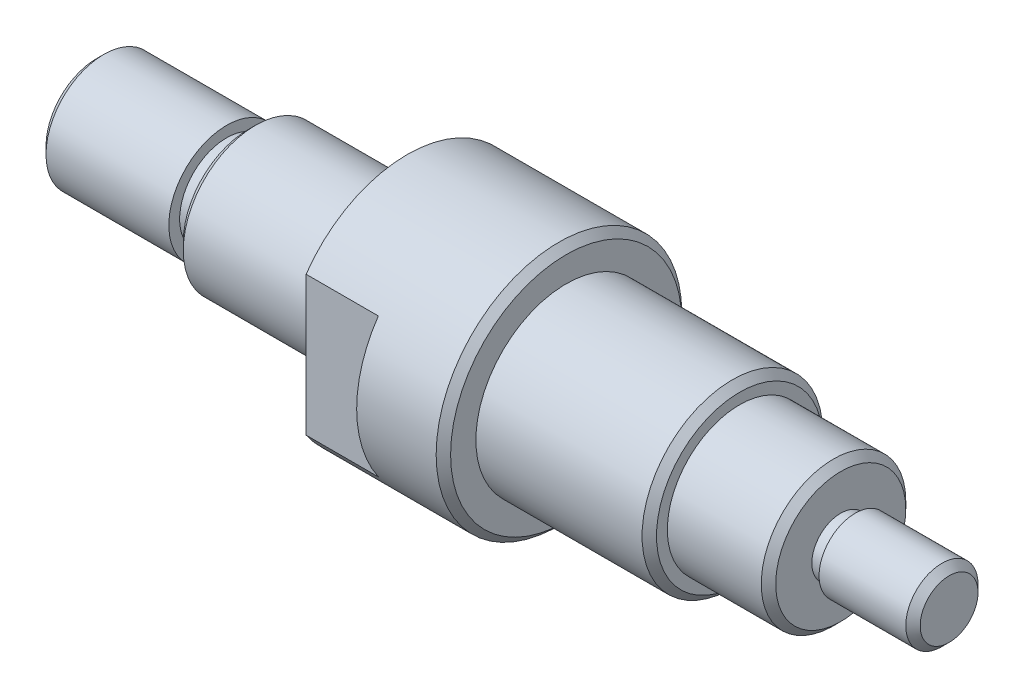
ISO-10303-21;
HEADER;
FILE_DESCRIPTION(('STEP AP214'),'2;1');
FILE_NAME('part.step','',(''),(''),'','','');
FILE_SCHEMA(('AUTOMOTIVE_DESIGN { 1 0 10303 214 1 1 1 1 }'));
ENDSEC;
DATA;
#1=APPLICATION_CONTEXT('core data for automotive mechanical design processes');
#2=APPLICATION_PROTOCOL_DEFINITION('international standard','automotive_design',2000,#1);
#3=PRODUCT_CONTEXT('',#1,'mechanical');
#4=PRODUCT('Part','Part','',(#3));
#5=PRODUCT_RELATED_PRODUCT_CATEGORY('part','',(#4));
#6=PRODUCT_DEFINITION_FORMATION('','',#4);
#7=PRODUCT_DEFINITION_CONTEXT('part definition',#1,'design');
#8=PRODUCT_DEFINITION('design','',#6,#7);
#9=PRODUCT_DEFINITION_SHAPE('','',#8);
#10=(LENGTH_UNIT() NAMED_UNIT(*) SI_UNIT(.MILLI.,.METRE.));
#11=(NAMED_UNIT(*) PLANE_ANGLE_UNIT() SI_UNIT($,.RADIAN.));
#12=(NAMED_UNIT(*) SI_UNIT($,.STERADIAN.) SOLID_ANGLE_UNIT());
#13=UNCERTAINTY_MEASURE_WITH_UNIT(LENGTH_MEASURE(1.E-05),#10,'distance_accuracy_value','');
#14=(GEOMETRIC_REPRESENTATION_CONTEXT(3) GLOBAL_UNCERTAINTY_ASSIGNED_CONTEXT((#13)) GLOBAL_UNIT_ASSIGNED_CONTEXT((#10,
#11,#12)) REPRESENTATION_CONTEXT('',''));
#15=CARTESIAN_POINT('',(0.,0.,0.));
#16=DIRECTION('',(0.,0.,1.));
#17=DIRECTION('',(1.,0.,0.));
#18=AXIS2_PLACEMENT_3D('',#15,#16,#17);
#19=CARTESIAN_POINT('',(0.,0.,0.));
#20=DIRECTION('',(1.,0.,0.));
#21=DIRECTION('',(0.,0.,-0.999999999999998));
#22=AXIS2_PLACEMENT_3D('',#19,#20,#21);
#23=CYLINDRICAL_SURFACE('',#22,17.);
#24=CARTESIAN_POINT('',(-54.,0.,0.));
#25=DIRECTION('',(1.,0.,0.));
#26=DIRECTION('',(0.,0.,-0.999999999999998));
#27=AXIS2_PLACEMENT_3D('',#24,#25,#26);
#28=CIRCLE('',#27,17.);
#29=CARTESIAN_POINT('',(-54.,0.,-17.));
#30=VERTEX_POINT('',#29);
#31=EDGE_CURVE('E195',#30,#30,#28,.F.);
#32=ORIENTED_EDGE('',*,*,#31,.T.);
#33=EDGE_LOOP('',(#32));
#34=FACE_BOUND('',#33,.T.);
#35=CARTESIAN_POINT('',(-65.,0.,0.));
#36=DIRECTION('',(-1.,0.,0.));
#37=DIRECTION('',(0.,0.,0.999999999999998));
#38=AXIS2_PLACEMENT_3D('',#35,#36,#37);
#39=CIRCLE('',#38,17.);
#40=CARTESIAN_POINT('',(-65.,9.64365076099291,-14.));
#41=VERTEX_POINT('',#40);
#42=CARTESIAN_POINT('',(-65.,-9.64365076099293,-14.));
#43=VERTEX_POINT('',#42);
#44=EDGE_CURVE('E104',#41,#43,#39,.T.);
#45=ORIENTED_EDGE('',*,*,#44,.F.);
#46=DIRECTION('',(-1.,0.,0.));
#47=VECTOR('',#46,1.);
#48=CARTESIAN_POINT('',(-65.,9.64365076099291,-14.));
#49=LINE('',#48,#47);
#50=CARTESIAN_POINT('',(-75.,9.64365076099291,-14.));
#51=VERTEX_POINT('',#50);
#52=EDGE_CURVE('E93',#41,#51,#49,.T.);
#53=ORIENTED_EDGE('',*,*,#52,.T.);
#54=CARTESIAN_POINT('',(-75.,0.,0.));
#55=DIRECTION('',(1.,0.,0.));
#56=DIRECTION('',(0.,0.,-0.999999999999998));
#57=AXIS2_PLACEMENT_3D('',#54,#55,#56);
#58=CIRCLE('',#57,17.);
#59=CARTESIAN_POINT('',(-75.,9.64365076099292,14.));
#60=VERTEX_POINT('',#59);
#61=EDGE_CURVE('E152',#51,#60,#58,.T.);
#62=ORIENTED_EDGE('',*,*,#61,.T.);
#63=DIRECTION('',(-1.,0.,0.));
#64=VECTOR('',#63,1.);
#65=CARTESIAN_POINT('',(-65.,9.64365076099292,14.));
#66=LINE('',#65,#64);
#67=CARTESIAN_POINT('',(-65.,9.64365076099292,14.));
#68=VERTEX_POINT('',#67);
#69=EDGE_CURVE('E76',#68,#60,#66,.T.);
#70=ORIENTED_EDGE('',*,*,#69,.F.);
#71=CARTESIAN_POINT('',(-65.,0.,0.));
#72=DIRECTION('',(-1.,0.,0.));
#73=DIRECTION('',(0.,0.,0.999999999999998));
#74=AXIS2_PLACEMENT_3D('',#71,#72,#73);
#75=CIRCLE('',#74,17.);
#76=CARTESIAN_POINT('',(-65.,-9.64365076099292,14.));
#77=VERTEX_POINT('',#76);
#78=EDGE_CURVE('E121',#77,#68,#75,.T.);
#79=ORIENTED_EDGE('',*,*,#78,.F.);
#80=DIRECTION('',(-1.,0.,0.));
#81=VECTOR('',#80,1.);
#82=CARTESIAN_POINT('',(-65.,-9.64365076099292,14.));
#83=LINE('',#82,#81);
#84=CARTESIAN_POINT('',(-75.,-9.64365076099292,14.));
#85=VERTEX_POINT('',#84);
#86=EDGE_CURVE('E117',#77,#85,#83,.T.);
#87=ORIENTED_EDGE('',*,*,#86,.T.);
#88=CARTESIAN_POINT('',(-75.,-9.64365076099293,-14.));
#89=VERTEX_POINT('',#88);
#90=EDGE_CURVE('E151',#85,#89,#58,.T.);
#91=ORIENTED_EDGE('',*,*,#90,.T.);
#92=DIRECTION('',(-1.,0.,0.));
#93=VECTOR('',#92,1.);
#94=CARTESIAN_POINT('',(-65.,-9.64365076099293,-14.));
#95=LINE('',#94,#93);
#96=EDGE_CURVE('E68',#43,#89,#95,.T.);
#97=ORIENTED_EDGE('',*,*,#96,.F.);
#98=EDGE_LOOP('',(#45,#53,#62,#70,#79,#87,#91,#97));
#99=FACE_BOUND('',#98,.T.);
#100=ADVANCED_FACE('F51',(#34,#99),#23,.T.);
#101=CARTESIAN_POINT('',(-75.,16.9999999999999,0.));
#102=DIRECTION('',(-1.,0.,0.));
#103=DIRECTION('',(0.,0.,0.999999999999998));
#104=AXIS2_PLACEMENT_3D('',#101,#102,#103);
#105=PLANE('',#104);
#106=CARTESIAN_POINT('',(-75.,0.,0.));
#107=DIRECTION('',(1.,0.,0.));
#108=DIRECTION('',(0.,0.,-0.999999999999998));
#109=AXIS2_PLACEMENT_3D('',#106,#107,#108);
#110=CIRCLE('',#109,9.99999999999999);
#111=CARTESIAN_POINT('',(-75.,0.,-9.99999999999998));
#112=VERTEX_POINT('',#111);
#113=EDGE_CURVE('E147',#112,#112,#110,.T.);
#114=ORIENTED_EDGE('',*,*,#113,.T.);
#115=EDGE_LOOP('',(#114));
#116=FACE_BOUND('',#115,.T.);
#117=ORIENTED_EDGE('',*,*,#61,.F.);
#118=DIRECTION('',(0.,-0.999999999999998,0.));
#119=VECTOR('',#118,1.);
#120=CARTESIAN_POINT('',(-75.,0.,-14.));
#121=LINE('',#120,#119);
#122=EDGE_CURVE('E98',#51,#89,#121,.T.);
#123=ORIENTED_EDGE('',*,*,#122,.T.);
#124=ORIENTED_EDGE('',*,*,#90,.F.);
#125=DIRECTION('',(0.,-0.999999999999998,0.));
#126=VECTOR('',#125,1.);
#127=CARTESIAN_POINT('',(-75.,0.,14.));
#128=LINE('',#127,#126);
#129=EDGE_CURVE('E125',#60,#85,#128,.T.);
#130=ORIENTED_EDGE('',*,*,#129,.F.);
#131=EDGE_LOOP('',(#117,#123,#124,#130));
#132=FACE_BOUND('',#131,.T.);
#133=ADVANCED_FACE('F235',(#116,#132),#105,.T.);
#134=CARTESIAN_POINT('',(0.,0.,0.));
#135=DIRECTION('',(1.,0.,0.));
#136=DIRECTION('',(0.,0.,-0.999999999999998));
#137=AXIS2_PLACEMENT_3D('',#134,#135,#136);
#138=PLANE('',#137);
#139=CARTESIAN_POINT('',(0.,0.,0.));
#140=DIRECTION('',(1.,0.,0.));
#141=DIRECTION('',(0.,0.,-0.999999999999998));
#142=AXIS2_PLACEMENT_3D('',#139,#140,#141);
#143=CIRCLE('',#142,3.99999999999999);
#144=CARTESIAN_POINT('',(0.,0.,-3.99999999999998));
#145=VERTEX_POINT('',#144);
#146=EDGE_CURVE('E61',#145,#145,#143,.T.);
#147=ORIENTED_EDGE('',*,*,#146,.T.);
#148=EDGE_LOOP('',(#147));
#149=FACE_BOUND('',#148,.T.);
#150=ADVANCED_FACE('F219',(#149),#138,.T.);
#151=CARTESIAN_POINT('',(0.,0.,0.));
#152=DIRECTION('',(1.,0.,0.));
#153=DIRECTION('',(0.,0.,-0.999999999999998));
#154=AXIS2_PLACEMENT_3D('',#151,#152,#153);
#155=CYLINDRICAL_SURFACE('',#154,5.);
#156=CARTESIAN_POINT('',(-1.00000000000001,0.,0.));
#157=DIRECTION('',(1.,0.,0.));
#158=DIRECTION('',(0.,0.,-0.999999999999998));
#159=AXIS2_PLACEMENT_3D('',#156,#157,#158);
#160=CIRCLE('',#159,5.);
#161=CARTESIAN_POINT('',(-1.00000000000001,0.,-4.99999999999999));
#162=VERTEX_POINT('',#161);
#163=EDGE_CURVE('E11',#162,#162,#160,.F.);
#164=ORIENTED_EDGE('',*,*,#163,.T.);
#165=EDGE_LOOP('',(#164));
#166=FACE_BOUND('',#165,.T.);
#167=CARTESIAN_POINT('',(-13.,0.,0.));
#168=DIRECTION('',(1.,0.,0.));
#169=DIRECTION('',(0.,0.,-0.999999999999998));
#170=AXIS2_PLACEMENT_3D('',#167,#168,#169);
#171=CIRCLE('',#170,5.);
#172=CARTESIAN_POINT('',(-13.,0.,-4.99999999999999));
#173=VERTEX_POINT('',#172);
#174=EDGE_CURVE('E171',#173,#173,#171,.T.);
#175=ORIENTED_EDGE('',*,*,#174,.T.);
#176=EDGE_LOOP('',(#175));
#177=FACE_BOUND('',#176,.T.);
#178=ADVANCED_FACE('F273',(#166,#177),#155,.T.);
#179=CARTESIAN_POINT('',(-13.,4.99999999999999,0.));
#180=DIRECTION('',(-1.,0.,0.));
#181=DIRECTION('',(0.,0.,0.999999999999998));
#182=AXIS2_PLACEMENT_3D('',#179,#180,#181);
#183=PLANE('',#182);
#184=CARTESIAN_POINT('',(-13.,0.,0.));
#185=DIRECTION('',(1.,0.,0.));
#186=DIRECTION('',(0.,0.,-0.999999999999998));
#187=AXIS2_PLACEMENT_3D('',#184,#185,#186);
#188=CIRCLE('',#187,4.00000000000005);
#189=CARTESIAN_POINT('',(-13.,0.,-4.00000000000004));
#190=VERTEX_POINT('',#189);
#191=EDGE_CURVE('E167',#190,#190,#188,.T.);
#192=ORIENTED_EDGE('',*,*,#191,.T.);
#193=EDGE_LOOP('',(#192));
#194=FACE_BOUND('',#193,.T.);
#195=ORIENTED_EDGE('',*,*,#174,.F.);
#196=EDGE_LOOP('',(#195));
#197=FACE_BOUND('',#196,.T.);
#198=ADVANCED_FACE('F269',(#194,#197),#183,.T.);
#199=CARTESIAN_POINT('',(0.,0.,0.));
#200=DIRECTION('',(1.,0.,0.));
#201=DIRECTION('',(0.,0.,-0.999999999999998));
#202=AXIS2_PLACEMENT_3D('',#199,#200,#201);
#203=CYLINDRICAL_SURFACE('',#202,4.00000000000005);
#204=CARTESIAN_POINT('',(-15.,0.,0.));
#205=DIRECTION('',(1.,0.,0.));
#206=DIRECTION('',(0.,0.,-0.999999999999998));
#207=AXIS2_PLACEMENT_3D('',#204,#205,#206);
#208=CIRCLE('',#207,4.00000000000005);
#209=CARTESIAN_POINT('',(-15.,0.,-4.00000000000004));
#210=VERTEX_POINT('',#209);
#211=EDGE_CURVE('E163',#210,#210,#208,.T.);
#212=ORIENTED_EDGE('',*,*,#211,.T.);
#213=EDGE_LOOP('',(#212));
#214=FACE_BOUND('',#213,.T.);
#215=ORIENTED_EDGE('',*,*,#191,.F.);
#216=EDGE_LOOP('',(#215));
#217=FACE_BOUND('',#216,.T.);
#218=ADVANCED_FACE('F265',(#214,#217),#203,.T.);
#219=CARTESIAN_POINT('',(-15.,4.00000000000004,0.));
#220=DIRECTION('',(1.,0.,0.));
#221=DIRECTION('',(0.,0.,-0.999999999999998));
#222=AXIS2_PLACEMENT_3D('',#219,#220,#221);
#223=PLANE('',#222);
#224=CARTESIAN_POINT('',(-15.,0.,0.));
#225=DIRECTION('',(1.,0.,0.));
#226=DIRECTION('',(0.,0.,-0.999999999999998));
#227=AXIS2_PLACEMENT_3D('',#224,#225,#226);
#228=CIRCLE('',#227,9.00000000000001);
#229=CARTESIAN_POINT('',(-15.,0.,-8.99999999999999));
#230=VERTEX_POINT('',#229);
#231=EDGE_CURVE('E207',#230,#230,#228,.T.);
#232=ORIENTED_EDGE('',*,*,#231,.T.);
#233=EDGE_LOOP('',(#232));
#234=FACE_BOUND('',#233,.T.);
#235=ORIENTED_EDGE('',*,*,#211,.F.);
#236=EDGE_LOOP('',(#235));
#237=FACE_BOUND('',#236,.T.);
#238=ADVANCED_FACE('F261',(#234,#237),#223,.T.);
#239=CARTESIAN_POINT('',(0.,0.,0.));
#240=DIRECTION('',(1.,0.,0.));
#241=DIRECTION('',(0.,0.,-0.999999999999998));
#242=AXIS2_PLACEMENT_3D('',#239,#240,#241);
#243=CYLINDRICAL_SURFACE('',#242,9.99999999999999);
#244=CARTESIAN_POINT('',(-16.,0.,0.));
#245=DIRECTION('',(1.,0.,0.));
#246=DIRECTION('',(0.,0.,-0.999999999999998));
#247=AXIS2_PLACEMENT_3D('',#244,#245,#246);
#248=CIRCLE('',#247,9.99999999999999);
#249=CARTESIAN_POINT('',(-16.,0.,-9.99999999999998));
#250=VERTEX_POINT('',#249);
#251=EDGE_CURVE('E211',#250,#250,#248,.F.);
#252=ORIENTED_EDGE('',*,*,#251,.T.);
#253=EDGE_LOOP('',(#252));
#254=FACE_BOUND('',#253,.T.);
#255=CARTESIAN_POINT('',(-29.,0.,0.));
#256=DIRECTION('',(1.,0.,0.));
#257=DIRECTION('',(0.,0.,-0.999999999999998));
#258=AXIS2_PLACEMENT_3D('',#255,#256,#257);
#259=CIRCLE('',#258,9.99999999999999);
#260=CARTESIAN_POINT('',(-29.,0.,-9.99999999999998));
#261=VERTEX_POINT('',#260);
#262=EDGE_CURVE('E159',#261,#261,#259,.T.);
#263=ORIENTED_EDGE('',*,*,#262,.T.);
#264=EDGE_LOOP('',(#263));
#265=FACE_BOUND('',#264,.T.);
#266=ADVANCED_FACE('F257',(#254,#265),#243,.T.);
#267=CARTESIAN_POINT('',(-29.,9.99999999999997,0.));
#268=DIRECTION('',(1.,0.,0.));
#269=DIRECTION('',(0.,0.,-0.999999999999998));
#270=AXIS2_PLACEMENT_3D('',#267,#268,#269);
#271=PLANE('',#270);
#272=CARTESIAN_POINT('',(-29.,0.,0.));
#273=DIRECTION('',(1.,0.,0.));
#274=DIRECTION('',(0.,0.,-0.999999999999998));
#275=AXIS2_PLACEMENT_3D('',#272,#273,#274);
#276=CIRCLE('',#275,11.5);
#277=CARTESIAN_POINT('',(-29.,0.,-11.5));
#278=VERTEX_POINT('',#277);
#279=EDGE_CURVE('E199',#278,#278,#276,.T.);
#280=ORIENTED_EDGE('',*,*,#279,.T.);
#281=EDGE_LOOP('',(#280));
#282=FACE_BOUND('',#281,.T.);
#283=ORIENTED_EDGE('',*,*,#262,.F.);
#284=EDGE_LOOP('',(#283));
#285=FACE_BOUND('',#284,.T.);
#286=ADVANCED_FACE('F253',(#282,#285),#271,.T.);
#287=CARTESIAN_POINT('',(0.,0.,0.));
#288=DIRECTION('',(1.,0.,0.));
#289=DIRECTION('',(0.,0.,-0.999999999999998));
#290=AXIS2_PLACEMENT_3D('',#287,#288,#289);
#291=CYLINDRICAL_SURFACE('',#290,12.5);
#292=CARTESIAN_POINT('',(-30.,0.,0.));
#293=DIRECTION('',(1.,0.,0.));
#294=DIRECTION('',(0.,0.,-0.999999999999998));
#295=AXIS2_PLACEMENT_3D('',#292,#293,#294);
#296=CIRCLE('',#295,12.5);
#297=CARTESIAN_POINT('',(-30.,0.,-12.5));
#298=VERTEX_POINT('',#297);
#299=EDGE_CURVE('E203',#298,#298,#296,.F.);
#300=ORIENTED_EDGE('',*,*,#299,.T.);
#301=EDGE_LOOP('',(#300));
#302=FACE_BOUND('',#301,.T.);
#303=CARTESIAN_POINT('',(-53.,0.,0.));
#304=DIRECTION('',(1.,0.,0.));
#305=DIRECTION('',(0.,0.,-0.999999999999998));
#306=AXIS2_PLACEMENT_3D('',#303,#304,#305);
#307=CIRCLE('',#306,12.5);
#308=CARTESIAN_POINT('',(-53.,0.,-12.5));
#309=VERTEX_POINT('',#308);
#310=EDGE_CURVE('E155',#309,#309,#307,.T.);
#311=ORIENTED_EDGE('',*,*,#310,.T.);
#312=EDGE_LOOP('',(#311));
#313=FACE_BOUND('',#312,.T.);
#314=ADVANCED_FACE('F249',(#302,#313),#291,.T.);
#315=CARTESIAN_POINT('',(-53.,12.5,0.));
#316=DIRECTION('',(1.,0.,0.));
#317=DIRECTION('',(0.,0.,-0.999999999999998));
#318=AXIS2_PLACEMENT_3D('',#315,#316,#317);
#319=PLANE('',#318);
#320=CARTESIAN_POINT('',(-53.,0.,0.));
#321=DIRECTION('',(1.,0.,0.));
#322=DIRECTION('',(0.,0.,-0.999999999999998));
#323=AXIS2_PLACEMENT_3D('',#320,#321,#322);
#324=CIRCLE('',#323,16.);
#325=CARTESIAN_POINT('',(-53.,0.,-16.));
#326=VERTEX_POINT('',#325);
#327=EDGE_CURVE('E191',#326,#326,#324,.T.);
#328=ORIENTED_EDGE('',*,*,#327,.T.);
#329=EDGE_LOOP('',(#328));
#330=FACE_BOUND('',#329,.T.);
#331=ORIENTED_EDGE('',*,*,#310,.F.);
#332=EDGE_LOOP('',(#331));
#333=FACE_BOUND('',#332,.T.);
#334=ADVANCED_FACE('F245',(#330,#333),#319,.T.);
#335=CARTESIAN_POINT('',(0.,0.,0.));
#336=DIRECTION('',(1.,0.,0.));
#337=DIRECTION('',(0.,0.,-0.999999999999998));
#338=AXIS2_PLACEMENT_3D('',#335,#336,#337);
#339=CYLINDRICAL_SURFACE('',#338,9.99999999999999);
#340=CARTESIAN_POINT('',(-96.,0.,0.));
#341=DIRECTION('',(-1.,0.,0.));
#342=DIRECTION('',(0.,0.,0.999999999999998));
#343=AXIS2_PLACEMENT_3D('',#340,#341,#342);
#344=CIRCLE('',#343,9.99999999999999);
#345=CARTESIAN_POINT('',(-96.,0.,9.99999999999998));
#346=VERTEX_POINT('',#345);
#347=EDGE_CURVE('E183',#346,#346,#344,.F.);
#348=ORIENTED_EDGE('',*,*,#347,.T.);
#349=EDGE_LOOP('',(#348));
#350=FACE_BOUND('',#349,.T.);
#351=ORIENTED_EDGE('',*,*,#113,.F.);
#352=EDGE_LOOP('',(#351));
#353=FACE_BOUND('',#352,.T.);
#354=ADVANCED_FACE('F248',(#350,#353),#339,.T.);
#355=CARTESIAN_POINT('',(-97.,9.99999999999997,0.));
#356=DIRECTION('',(-1.,0.,0.));
#357=DIRECTION('',(0.,0.,0.999999999999998));
#358=AXIS2_PLACEMENT_3D('',#355,#356,#357);
#359=PLANE('',#358);
#360=CARTESIAN_POINT('',(-97.,0.,0.));
#361=DIRECTION('',(-1.,0.,0.));
#362=DIRECTION('',(0.,0.,0.999999999999998));
#363=AXIS2_PLACEMENT_3D('',#360,#361,#362);
#364=CIRCLE('',#363,8.99999999999999);
#365=CARTESIAN_POINT('',(-97.,0.,8.99999999999998));
#366=VERTEX_POINT('',#365);
#367=EDGE_CURVE('E187',#366,#366,#364,.T.);
#368=ORIENTED_EDGE('',*,*,#367,.T.);
#369=EDGE_LOOP('',(#368));
#370=FACE_BOUND('',#369,.T.);
#371=CARTESIAN_POINT('',(-97.,0.,0.));
#372=DIRECTION('',(1.,0.,0.));
#373=DIRECTION('',(0.,0.,-0.999999999999998));
#374=AXIS2_PLACEMENT_3D('',#371,#372,#373);
#375=CIRCLE('',#374,6.49999999999999);
#376=CARTESIAN_POINT('',(-97.,0.,-6.49999999999998));
#377=VERTEX_POINT('',#376);
#378=EDGE_CURVE('E143',#377,#377,#375,.T.);
#379=ORIENTED_EDGE('',*,*,#378,.T.);
#380=EDGE_LOOP('',(#379));
#381=FACE_BOUND('',#380,.T.);
#382=ADVANCED_FACE('F387',(#370,#381),#359,.T.);
#383=CARTESIAN_POINT('',(0.,0.,0.));
#384=DIRECTION('',(1.,0.,0.));
#385=DIRECTION('',(0.,0.,-0.999999999999998));
#386=AXIS2_PLACEMENT_3D('',#383,#384,#385);
#387=CYLINDRICAL_SURFACE('',#386,6.49999999999999);
#388=CARTESIAN_POINT('',(-100.,0.,0.));
#389=DIRECTION('',(1.,0.,0.));
#390=DIRECTION('',(0.,0.,-0.999999999999998));
#391=AXIS2_PLACEMENT_3D('',#388,#389,#390);
#392=CIRCLE('',#391,6.49999999999999);
#393=CARTESIAN_POINT('',(-100.,0.,-6.49999999999998));
#394=VERTEX_POINT('',#393);
#395=EDGE_CURVE('E139',#394,#394,#392,.T.);
#396=ORIENTED_EDGE('',*,*,#395,.T.);
#397=EDGE_LOOP('',(#396));
#398=FACE_BOUND('',#397,.T.);
#399=ORIENTED_EDGE('',*,*,#378,.F.);
#400=EDGE_LOOP('',(#399));
#401=FACE_BOUND('',#400,.T.);
#402=ADVANCED_FACE('F383',(#398,#401),#387,.T.);
#403=CARTESIAN_POINT('',(-100.,6.49999999999998,0.));
#404=DIRECTION('',(1.,0.,0.));
#405=DIRECTION('',(0.,0.,-0.999999999999998));
#406=AXIS2_PLACEMENT_3D('',#403,#404,#405);
#407=PLANE('',#406);
#408=CARTESIAN_POINT('',(-100.,0.,0.));
#409=DIRECTION('',(1.,0.,0.));
#410=DIRECTION('',(0.,0.,-0.999999999999998));
#411=AXIS2_PLACEMENT_3D('',#408,#409,#410);
#412=CIRCLE('',#411,8.00000000000002);
#413=CARTESIAN_POINT('',(-100.,0.,-8.00000000000001));
#414=VERTEX_POINT('',#413);
#415=EDGE_CURVE('E119',#414,#414,#412,.T.);
#416=ORIENTED_EDGE('',*,*,#415,.T.);
#417=EDGE_LOOP('',(#416));
#418=FACE_BOUND('',#417,.T.);
#419=ORIENTED_EDGE('',*,*,#395,.F.);
#420=EDGE_LOOP('',(#419));
#421=FACE_BOUND('',#420,.T.);
#422=ADVANCED_FACE('F379',(#418,#421),#407,.T.);
#423=CARTESIAN_POINT('',(0.,0.,0.));
#424=DIRECTION('',(1.,0.,0.));
#425=DIRECTION('',(0.,0.,-0.999999999999998));
#426=AXIS2_PLACEMENT_3D('',#423,#424,#425);
#427=CYLINDRICAL_SURFACE('',#426,8.00000000000002);
#428=CARTESIAN_POINT('',(-117.,0.,0.));
#429=DIRECTION('',(-1.,0.,0.));
#430=DIRECTION('',(0.,0.,0.999999999999998));
#431=AXIS2_PLACEMENT_3D('',#428,#429,#430);
#432=CIRCLE('',#431,8.00000000000002);
#433=CARTESIAN_POINT('',(-117.,0.,8.00000000000001));
#434=VERTEX_POINT('',#433);
#435=EDGE_CURVE('E175',#434,#434,#432,.F.);
#436=ORIENTED_EDGE('',*,*,#435,.T.);
#437=EDGE_LOOP('',(#436));
#438=FACE_BOUND('',#437,.T.);
#439=ORIENTED_EDGE('',*,*,#415,.F.);
#440=EDGE_LOOP('',(#439));
#441=FACE_BOUND('',#440,.T.);
#442=ADVANCED_FACE('F375',(#438,#441),#427,.T.);
#443=CARTESIAN_POINT('',(-118.,7.99999999999999,0.));
#444=DIRECTION('',(-1.,0.,0.));
#445=DIRECTION('',(0.,0.,0.999999999999998));
#446=AXIS2_PLACEMENT_3D('',#443,#444,#445);
#447=PLANE('',#446);
#448=CARTESIAN_POINT('',(-118.,0.,0.));
#449=DIRECTION('',(-1.,0.,0.));
#450=DIRECTION('',(0.,0.,0.999999999999998));
#451=AXIS2_PLACEMENT_3D('',#448,#449,#450);
#452=CIRCLE('',#451,7.00000000000003);
#453=CARTESIAN_POINT('',(-118.,0.,7.00000000000002));
#454=VERTEX_POINT('',#453);
#455=EDGE_CURVE('E179',#454,#454,#452,.T.);
#456=ORIENTED_EDGE('',*,*,#455,.T.);
#457=EDGE_LOOP('',(#456));
#458=FACE_BOUND('',#457,.T.);
#459=ADVANCED_FACE('F288',(#458),#447,.T.);
#460=CARTESIAN_POINT('',(-117.,0.,0.));
#461=DIRECTION('',(1.,0.,0.));
#462=DIRECTION('',(0.,0.,-0.999999999999998));
#463=AXIS2_PLACEMENT_3D('',#460,#461,#462);
#464=CONICAL_SURFACE('',#463,8.00000000000002,0.785398163397448);
#465=ORIENTED_EDGE('',*,*,#455,.F.);
#466=EDGE_LOOP('',(#465));
#467=FACE_BOUND('',#466,.T.);
#468=ORIENTED_EDGE('',*,*,#435,.F.);
#469=EDGE_LOOP('',(#468));
#470=FACE_BOUND('',#469,.T.);
#471=ADVANCED_FACE('F281',(#467,#470),#464,.T.);
#472=CARTESIAN_POINT('',(-96.,0.,0.));
#473=DIRECTION('',(1.,0.,0.));
#474=DIRECTION('',(0.,0.,-0.999999999999998));
#475=AXIS2_PLACEMENT_3D('',#472,#473,#474);
#476=CONICAL_SURFACE('',#475,9.99999999999999,0.785398163397453);
#477=ORIENTED_EDGE('',*,*,#367,.F.);
#478=EDGE_LOOP('',(#477));
#479=FACE_BOUND('',#478,.T.);
#480=ORIENTED_EDGE('',*,*,#347,.F.);
#481=EDGE_LOOP('',(#480));
#482=FACE_BOUND('',#481,.T.);
#483=ADVANCED_FACE('F287',(#479,#482),#476,.T.);
#484=CARTESIAN_POINT('',(-53.,0.,0.));
#485=DIRECTION('',(-1.,0.,0.));
#486=DIRECTION('',(0.,0.,0.999999999999998));
#487=AXIS2_PLACEMENT_3D('',#484,#485,#486);
#488=CONICAL_SURFACE('',#487,16.,0.785398163397452);
#489=ORIENTED_EDGE('',*,*,#31,.F.);
#490=EDGE_LOOP('',(#489));
#491=FACE_BOUND('',#490,.T.);
#492=ORIENTED_EDGE('',*,*,#327,.F.);
#493=EDGE_LOOP('',(#492));
#494=FACE_BOUND('',#493,.T.);
#495=ADVANCED_FACE('F295',(#491,#494),#488,.T.);
#496=CARTESIAN_POINT('',(-29.,0.,0.));
#497=DIRECTION('',(-1.,0.,0.));
#498=DIRECTION('',(0.,0.,0.999999999999998));
#499=AXIS2_PLACEMENT_3D('',#496,#497,#498);
#500=CONICAL_SURFACE('',#499,11.5,0.785398163397448);
#501=ORIENTED_EDGE('',*,*,#299,.F.);
#502=EDGE_LOOP('',(#501));
#503=FACE_BOUND('',#502,.T.);
#504=ORIENTED_EDGE('',*,*,#279,.F.);
#505=EDGE_LOOP('',(#504));
#506=FACE_BOUND('',#505,.T.);
#507=ADVANCED_FACE('F231',(#503,#506),#500,.T.);
#508=CARTESIAN_POINT('',(-15.,0.,0.));
#509=DIRECTION('',(-1.,0.,0.));
#510=DIRECTION('',(0.,0.,0.999999999999998));
#511=AXIS2_PLACEMENT_3D('',#508,#509,#510);
#512=CONICAL_SURFACE('',#511,9.00000000000001,0.785398163397447);
#513=ORIENTED_EDGE('',*,*,#251,.F.);
#514=EDGE_LOOP('',(#513));
#515=FACE_BOUND('',#514,.T.);
#516=ORIENTED_EDGE('',*,*,#231,.F.);
#517=EDGE_LOOP('',(#516));
#518=FACE_BOUND('',#517,.T.);
#519=ADVANCED_FACE('F223',(#515,#518),#512,.T.);
#520=CARTESIAN_POINT('',(0.,0.,0.));
#521=DIRECTION('',(-1.,0.,0.));
#522=DIRECTION('',(0.,0.,0.999999999999998));
#523=AXIS2_PLACEMENT_3D('',#520,#521,#522);
#524=CONICAL_SURFACE('',#523,3.99999999999999,0.785398163397448);
#525=ORIENTED_EDGE('',*,*,#163,.F.);
#526=EDGE_LOOP('',(#525));
#527=FACE_BOUND('',#526,.T.);
#528=ORIENTED_EDGE('',*,*,#146,.F.);
#529=EDGE_LOOP('',(#528));
#530=FACE_BOUND('',#529,.T.);
#531=ADVANCED_FACE('F54',(#527,#530),#524,.T.);
#532=CARTESIAN_POINT('',(-65.,0.,14.));
#533=DIRECTION('',(0.,0.,-0.999999999999998));
#534=DIRECTION('',(-1.,0.,0.));
#535=AXIS2_PLACEMENT_3D('',#532,#533,#534);
#536=PLANE('',#535);
#537=ORIENTED_EDGE('',*,*,#129,.T.);
#538=ORIENTED_EDGE('',*,*,#86,.F.);
#539=DIRECTION('',(0.,-0.999999999999998,0.));
#540=VECTOR('',#539,1.);
#541=CARTESIAN_POINT('',(-65.,0.,14.));
#542=LINE('',#541,#540);
#543=EDGE_CURVE('E124',#68,#77,#542,.T.);
#544=ORIENTED_EDGE('',*,*,#543,.F.);
#545=ORIENTED_EDGE('',*,*,#69,.T.);
#546=EDGE_LOOP('',(#537,#538,#544,#545));
#547=FACE_BOUND('',#546,.T.);
#548=ADVANCED_FACE('F222',(#547),#536,.F.);
#549=CARTESIAN_POINT('',(-65.,0.,0.));
#550=DIRECTION('',(-1.,0.,0.));
#551=DIRECTION('',(0.,0.,0.999999999999998));
#552=AXIS2_PLACEMENT_3D('',#549,#550,#551);
#553=PLANE('',#552);
#554=ORIENTED_EDGE('',*,*,#78,.T.);
#555=ORIENTED_EDGE('',*,*,#543,.T.);
#556=EDGE_LOOP('',(#554,#555));
#557=FACE_BOUND('',#556,.T.);
#558=ADVANCED_FACE('F229',(#557),#553,.T.);
#559=CARTESIAN_POINT('',(-65.,0.,-14.));
#560=DIRECTION('',(0.,0.,-0.999999999999998));
#561=DIRECTION('',(-1.,0.,0.));
#562=AXIS2_PLACEMENT_3D('',#559,#560,#561);
#563=PLANE('',#562);
#564=ORIENTED_EDGE('',*,*,#122,.F.);
#565=ORIENTED_EDGE('',*,*,#52,.F.);
#566=DIRECTION('',(0.,-0.999999999999998,0.));
#567=VECTOR('',#566,1.);
#568=CARTESIAN_POINT('',(-65.,0.,-14.));
#569=LINE('',#568,#567);
#570=EDGE_CURVE('E96',#41,#43,#569,.T.);
#571=ORIENTED_EDGE('',*,*,#570,.T.);
#572=ORIENTED_EDGE('',*,*,#96,.T.);
#573=EDGE_LOOP('',(#564,#565,#571,#572));
#574=FACE_BOUND('',#573,.T.);
#575=ADVANCED_FACE('F95',(#574),#563,.T.);
#576=CARTESIAN_POINT('',(-65.,0.,0.));
#577=DIRECTION('',(-1.,0.,0.));
#578=DIRECTION('',(0.,0.,0.999999999999998));
#579=AXIS2_PLACEMENT_3D('',#576,#577,#578);
#580=PLANE('',#579);
#581=ORIENTED_EDGE('',*,*,#570,.F.);
#582=ORIENTED_EDGE('',*,*,#44,.T.);
#583=EDGE_LOOP('',(#581,#582));
#584=FACE_BOUND('',#583,.T.);
#585=ADVANCED_FACE('F107',(#584),#580,.T.);
#586=CLOSED_SHELL('',(#100,#133,#150,#178,#198,#218,#238,#266,#286,#314,#334,#354,#382,#402,
#422,#442,#459,#471,#483,#495,#507,#519,#531,#548,#558,#575,#585));
#587=MANIFOLD_SOLID_BREP('B2',#586);
#588=ADVANCED_BREP_SHAPE_REPRESENTATION('',(#18,#587),#14);
#589=SHAPE_DEFINITION_REPRESENTATION(#9,#588);
ENDSEC;
END-ISO-10303-21;
